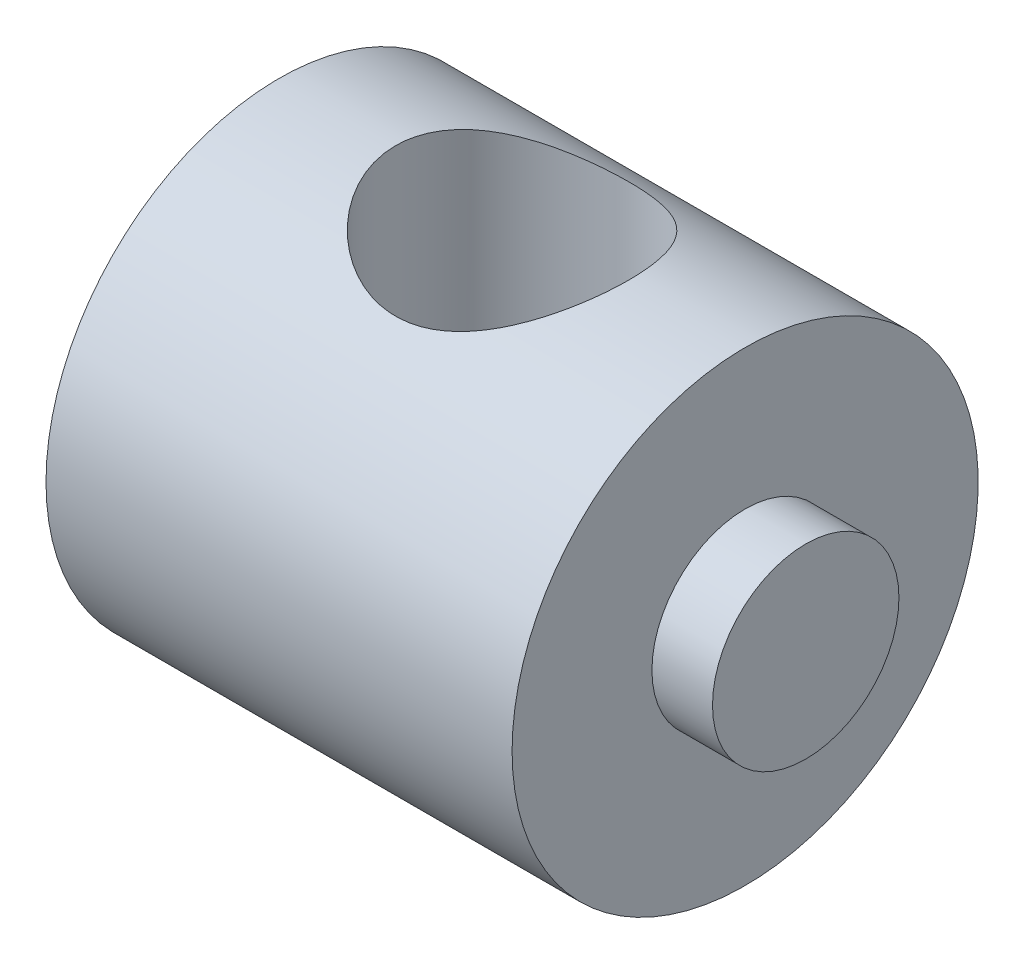
ISO-10303-21;
HEADER;
FILE_DESCRIPTION(('STEP AP214'),'2;1');
FILE_NAME('part.step','',(''),(''),'','','');
FILE_SCHEMA(('AUTOMOTIVE_DESIGN { 1 0 10303 214 1 1 1 1 }'));
ENDSEC;
DATA;
#1=APPLICATION_CONTEXT('core data for automotive mechanical design processes');
#2=APPLICATION_PROTOCOL_DEFINITION('international standard','automotive_design',2000,#1);
#3=PRODUCT_CONTEXT('',#1,'mechanical');
#4=PRODUCT('Part','Part','',(#3));
#5=PRODUCT_RELATED_PRODUCT_CATEGORY('part','',(#4));
#6=PRODUCT_DEFINITION_FORMATION('','',#4);
#7=PRODUCT_DEFINITION_CONTEXT('part definition',#1,'design');
#8=PRODUCT_DEFINITION('design','',#6,#7);
#9=PRODUCT_DEFINITION_SHAPE('','',#8);
#10=(LENGTH_UNIT() NAMED_UNIT(*) SI_UNIT(.MILLI.,.METRE.));
#11=(NAMED_UNIT(*) PLANE_ANGLE_UNIT() SI_UNIT($,.RADIAN.));
#12=(NAMED_UNIT(*) SI_UNIT($,.STERADIAN.) SOLID_ANGLE_UNIT());
#13=UNCERTAINTY_MEASURE_WITH_UNIT(LENGTH_MEASURE(1.E-05),#10,'distance_accuracy_value','');
#14=(GEOMETRIC_REPRESENTATION_CONTEXT(3) GLOBAL_UNCERTAINTY_ASSIGNED_CONTEXT((#13)) GLOBAL_UNIT_ASSIGNED_CONTEXT((#10,
#11,#12)) REPRESENTATION_CONTEXT('',''));
#15=CARTESIAN_POINT('',(0.,0.,0.));
#16=DIRECTION('',(0.,0.,1.));
#17=DIRECTION('',(1.,0.,0.));
#18=AXIS2_PLACEMENT_3D('',#15,#16,#17);
#19=CARTESIAN_POINT('',(0.,0.,0.));
#20=DIRECTION('',(-1.,0.,0.));
#21=DIRECTION('',(0.,0.,1.));
#22=AXIS2_PLACEMENT_3D('',#19,#20,#21);
#23=CYLINDRICAL_SURFACE('',#22,10.);
#24=CARTESIAN_POINT('',(2.6,0.,0.));
#25=DIRECTION('',(-1.,0.,0.));
#26=DIRECTION('',(0.,0.,1.));
#27=AXIS2_PLACEMENT_3D('',#24,#25,#26);
#28=CIRCLE('',#27,10.);
#29=CARTESIAN_POINT('',(2.6,0.,10.));
#30=VERTEX_POINT('',#29);
#31=EDGE_CURVE('E105',#30,#30,#28,.T.);
#32=ORIENTED_EDGE('',*,*,#31,.F.);
#33=EDGE_LOOP('',(#32));
#34=FACE_BOUND('',#33,.T.);
#35=CARTESIAN_POINT('',(22.6,0.,0.));
#36=DIRECTION('',(-1.,0.,0.));
#37=DIRECTION('',(0.,0.,1.));
#38=AXIS2_PLACEMENT_3D('',#35,#36,#37);
#39=CIRCLE('',#38,10.);
#40=CARTESIAN_POINT('',(22.6,0.,10.));
#41=VERTEX_POINT('',#40);
#42=EDGE_CURVE('E107',#41,#41,#39,.T.);
#43=ORIENTED_EDGE('',*,*,#42,.T.);
#44=EDGE_LOOP('',(#43));
#45=FACE_BOUND('',#44,.T.);
#46=CARTESIAN_POINT('',(7.6,10.,0.));
#47=CARTESIAN_POINT('',(7.60000043221603,9.99999960171885,0.131488890078729));
#48=CARTESIAN_POINT('',(7.60519277528512,9.99740053121283,0.262986970217151));
#49=CARTESIAN_POINT('',(7.62590289411204,9.98706977835168,0.525014586348055));
#50=CARTESIAN_POINT('',(7.64142516176398,9.97933586314931,0.655543676003294));
#51=CARTESIAN_POINT('',(7.68264077947734,9.95892066969002,0.914783203431132));
#52=CARTESIAN_POINT('',(7.70834863440625,9.94623233642881,1.04349077535257));
#53=CARTESIAN_POINT('',(7.76965067256346,9.91622716576671,1.29802636754293));
#54=CARTESIAN_POINT('',(7.80524889740563,9.89890843630383,1.42385318781692));
#55=CARTESIAN_POINT('',(7.8857784824513,9.86015430154804,1.67121386584967));
#56=CARTESIAN_POINT('',(7.93066864854805,9.83873709670758,1.79276399094561));
#57=CARTESIAN_POINT('',(8.02944879780695,9.79224427489324,2.03144447751189));
#58=CARTESIAN_POINT('',(8.08334216819345,9.7671672814684,2.14857315511665));
#59=CARTESIAN_POINT('',(8.25779962893898,9.68730860488736,2.49222561412914));
#60=CARTESIAN_POINT('',(8.39123077324006,9.6278546021617,2.71128846115303));
#61=CARTESIAN_POINT('',(8.69760528124455,9.49780663424161,3.13758045755123));
#62=CARTESIAN_POINT('',(8.87245069027972,9.42675632671347,3.34329192972867));
#63=CARTESIAN_POINT('',(9.25258908828315,9.28300214475253,3.72388133818107));
#64=CARTESIAN_POINT('',(9.45790506198385,9.21029705743543,3.89873577832562));
#65=CARTESIAN_POINT('',(9.91247514746428,9.06493867332993,4.22628385620054));
#66=CARTESIAN_POINT('',(10.1639018913175,8.99272664170302,4.37620734766693));
#67=CARTESIAN_POINT('',(10.5599180443676,8.89637417546677,4.56723365243867));
#68=CARTESIAN_POINT('',(10.6951182905603,8.86624279684719,4.62527981130997));
#69=CARTESIAN_POINT('',(10.9710012517741,8.81109611627222,4.72948843578256));
#70=CARTESIAN_POINT('',(11.1116806636392,8.78607778701962,4.77565793744269));
#71=CARTESIAN_POINT('',(11.388992754156,8.74350562362059,4.85313805846159));
#72=CARTESIAN_POINT('',(11.5253704799779,8.72559704108876,4.88516762296958));
#73=CARTESIAN_POINT('',(11.8009256974796,8.69596333711106,4.93772573892405));
#74=CARTESIAN_POINT('',(11.9401016630061,8.68423493515241,4.95826039236648));
#75=CARTESIAN_POINT('',(12.2200074611112,8.66746161087014,4.98752398958935));
#76=CARTESIAN_POINT('',(12.3607363063141,8.66241266349288,4.99626004329765));
#77=CARTESIAN_POINT('',(12.6425011762896,8.65921299638945,5.00180399494054));
#78=CARTESIAN_POINT('',(12.7835371704714,8.66106161851229,4.99861303092503));
#79=CARTESIAN_POINT('',(13.0477035728769,8.67093727173593,4.98145803092845));
#80=CARTESIAN_POINT('',(13.1709526028102,8.6781966350113,4.96883208371091));
#81=CARTESIAN_POINT('',(13.4158212139671,8.69773906996623,4.93454402662215));
#82=CARTESIAN_POINT('',(13.5374402710219,8.71002371946268,4.91287907868333));
#83=CARTESIAN_POINT('',(13.7781978743128,8.73921479576949,4.86076278292653));
#84=CARTESIAN_POINT('',(13.89733672485,8.75612065195561,4.83031251988904));
#85=CARTESIAN_POINT('',(14.1324713769544,8.79403073984606,4.76094319159973));
#86=CARTESIAN_POINT('',(14.2484659232761,8.81503658165342,4.72202079856857));
#87=CARTESIAN_POINT('',(14.5960068716186,8.88436032421636,4.59108661358501));
#88=CARTESIAN_POINT('',(14.8216933560379,8.93828791833521,4.48608785825886));
#89=CARTESIAN_POINT('',(15.2532101182228,9.05517433078602,4.24519591002764));
#90=CARTESIAN_POINT('',(15.4590314177592,9.11813720101032,4.10928884013355));
#91=CARTESIAN_POINT('',(15.8725885282038,9.25565455759079,3.79034422310328));
#92=CARTESIAN_POINT('',(16.0772580077073,9.3306665420313,3.60351571642877));
#93=CARTESIAN_POINT('',(16.4537034656887,9.47739013910051,3.19773444843253));
#94=CARTESIAN_POINT('',(16.6254637238212,9.54910016205801,2.97876642220598));
#95=CARTESIAN_POINT('',(16.8584408971132,9.65034506582221,2.62430600098781));
#96=CARTESIAN_POINT('',(16.9333520951455,9.68370380274255,2.49871002336159));
#97=CARTESIAN_POINT('',(17.0722082029724,9.74663052718473,2.2407106014256));
#98=CARTESIAN_POINT('',(17.1361577355911,9.77620011135783,2.1083100575541));
#99=CARTESIAN_POINT('',(17.2523988753834,9.83067553510545,1.83762803314804));
#100=CARTESIAN_POINT('',(17.3046951755248,9.85558325144946,1.69934894682179));
#101=CARTESIAN_POINT('',(17.39702492908,9.89999026457503,1.41791187896083));
#102=CARTESIAN_POINT('',(17.4370597931822,9.91949018350378,1.27475446078987));
#103=CARTESIAN_POINT('',(17.501533563503,9.95109597328192,0.996798015430413));
#104=CARTESIAN_POINT('',(17.5269895154024,9.96368046334326,0.862288674029798));
#105=CARTESIAN_POINT('',(17.5668080412236,9.98343035732267,0.591248360012467));
#106=CARTESIAN_POINT('',(17.5811715957901,9.99059624028198,0.454717567193952));
#107=CARTESIAN_POINT('',(17.5986131620341,9.99930380487356,0.180810709359647));
#108=CARTESIAN_POINT('',(17.6016954942669,10.000847639673,0.0434349881359));
#109=CARTESIAN_POINT('',(17.5965444260812,9.99827237859039,-0.23104760858155));
#110=CARTESIAN_POINT('',(17.5883115264507,9.99415353332644,-0.368154495704339));
#111=CARTESIAN_POINT('',(17.561721326159,9.98090973082445,-0.630324023952244));
#112=CARTESIAN_POINT('',(17.5442016224066,9.97219922243105,-0.755493751243217));
#113=CARTESIAN_POINT('',(17.4998255264294,9.95027227352716,-1.00380426086804));
#114=CARTESIAN_POINT('',(17.4729661769068,9.93705440583578,-1.12694438760008));
#115=CARTESIAN_POINT('',(17.4101973166375,9.90642450404114,-1.37032307172125));
#116=CARTESIAN_POINT('',(17.3742905753219,9.88901375346268,-1.49056250470176));
#117=CARTESIAN_POINT('',(17.2937718386768,9.85039368148873,-1.72747946867538));
#118=CARTESIAN_POINT('',(17.2491565086473,9.82918290524069,-1.84415561535681));
#119=CARTESIAN_POINT('',(17.1000521931497,9.75922876416581,-2.19430354472275));
#120=CARTESIAN_POINT('',(16.9820592582149,9.70504904478179,-2.42111320848944));
#121=CARTESIAN_POINT('',(16.7144478067803,9.58719375745591,-2.8523456015808));
#122=CARTESIAN_POINT('',(16.5648158180077,9.5235141477638,-3.05675873773466));
#123=CARTESIAN_POINT('',(16.2212127089634,9.38541505392103,-3.45882132675025));
#124=CARTESIAN_POINT('',(16.0243304082476,9.31055499361994,-3.65383533419946));
#125=CARTESIAN_POINT('',(15.600329462866,9.16310881759143,-4.00930667677967));
#126=CARTESIAN_POINT('',(15.3731900760017,9.09052430437331,-4.16974010650665));
#127=CARTESIAN_POINT('',(15.0075094337707,8.98785260582618,-4.38466016919211));
#128=CARTESIAN_POINT('',(14.8781491254565,8.95395955241383,-4.4532676226712));
#129=CARTESIAN_POINT('',(14.613105899221,8.89022352415078,-4.57918112262683));
#130=CARTESIAN_POINT('',(14.4774258796241,8.86037871680369,-4.63649228788887));
#131=CARTESIAN_POINT('',(14.2007229646748,8.80590327365628,-4.73913999074898));
#132=CARTESIAN_POINT('',(14.05970454425,8.78126837994729,-4.78448631442401));
#133=CARTESIAN_POINT('',(13.7733089571752,8.73822819098157,-4.86265004333096));
#134=CARTESIAN_POINT('',(13.6279324691725,8.7198219312185,-4.89546938847111));
#135=CARTESIAN_POINT('',(13.3482350184647,8.69151275671387,-4.94553834792942));
#136=CARTESIAN_POINT('',(13.2141921168801,8.6809632703526,-4.96397997433445));
#137=CARTESIAN_POINT('',(12.9447147543026,8.66606824539577,-4.98993873206132));
#138=CARTESIAN_POINT('',(12.8092804406048,8.66172205679783,-4.99745700797003));
#139=CARTESIAN_POINT('',(12.5382430749954,8.65941425656731,-5.00145477351748));
#140=CARTESIAN_POINT('',(12.4026400991504,8.66145040076354,-4.99793814327598));
#141=CARTESIAN_POINT('',(12.1324144420521,8.67181681785816,-4.97992974203946));
#142=CARTESIAN_POINT('',(11.9977917208955,8.68014683308828,-4.96543842034336));
#143=CARTESIAN_POINT('',(11.743439797841,8.70167828744801,-4.92759757627215));
#144=CARTESIAN_POINT('',(11.6235174403761,8.71433770908853,-4.90522766015));
#145=CARTESIAN_POINT('',(11.3861388094325,8.74411599480516,-4.85194376743193));
#146=CARTESIAN_POINT('',(11.268683310666,8.76123623781642,-4.82102714868722));
#147=CARTESIAN_POINT('',(10.9210828848871,8.81854231868724,-4.71590306073959));
#148=CARTESIAN_POINT('',(10.695543905014,8.86468813771129,-4.62929708984156));
#149=CARTESIAN_POINT('',(10.2468396576875,8.97142890954605,-4.41907164675021));
#150=CARTESIAN_POINT('',(10.0248519240107,9.03278633647388,-4.29335633682031));
#151=CARTESIAN_POINT('',(9.60363589040429,9.16176636495219,-4.01075421010745));
#152=CARTESIAN_POINT('',(9.40441951655584,9.22939221620456,-3.85385117607732));
#153=CARTESIAN_POINT('',(9.00929214152929,9.37311444600789,-3.49102748964406));
#154=CARTESIAN_POINT('',(8.81672398123239,9.44924162905911,-3.28146736342599));
#155=CARTESIAN_POINT('',(8.46866557881673,9.59389514971535,-2.83072875767415));
#156=CARTESIAN_POINT('',(8.31319532225643,9.66241737976037,-2.58953334336126));
#157=CARTESIAN_POINT('',(8.11136958547318,9.7541901337583,-2.20753881885374));
#158=CARTESIAN_POINT('',(8.04913292059363,9.78304209980293,-2.07625512570271));
#159=CARTESIAN_POINT('',(7.93606384387963,9.83614745234555,-1.80799529933999));
#160=CARTESIAN_POINT('',(7.88522582946939,9.86040309707969,-1.67102200205151));
#161=CARTESIAN_POINT('',(7.79565456163282,9.90354484128718,-1.39269501068688));
#162=CARTESIAN_POINT('',(7.75689490701229,9.92244264379385,-1.25135162347081));
#163=CARTESIAN_POINT('',(7.69186240373143,9.95434618112011,-0.965237205795559));
#164=CARTESIAN_POINT('',(7.66558192747297,9.96735551489675,-0.820468326048374));
#165=CARTESIAN_POINT('',(7.63052546800114,9.98476387878718,-0.56304165440816));
#166=CARTESIAN_POINT('',(7.61908824630799,9.99046741601665,-0.450825809730025));
#167=CARTESIAN_POINT('',(7.60382522174986,9.99808569986015,-0.225742246050266));
#168=CARTESIAN_POINT('',(7.59999962897115,10.000000341898,-0.112874509142188));
#169=CARTESIAN_POINT('',(7.6,10.,0.));
#170=B_SPLINE_CURVE_WITH_KNOTS('',3,(#46,#47,#48,#49,#50,#51,#52,#53,#54,#55,#56,#57,#58,#59,
#60,#61,#62,#63,#64,#65,#66,#67,#68,#69,#70,#71,#72,#73,#74,#75,#76,#77,#78,#79,#80,#81,#82,#83,
#84,#85,#86,#87,#88,#89,#90,#91,#92,#93,#94,#95,#96,#97,#98,#99,#100,#101,#102,#103,#104,#105,
#106,#107,#108,#109,#110,#111,#112,#113,#114,#115,#116,#117,#118,#119,#120,#121,#122,#123,#124,
#125,#126,#127,#128,#129,#130,#131,#132,#133,#134,#135,#136,#137,#138,#139,#140,#141,#142,#143,
#144,#145,#146,#147,#148,#149,#150,#151,#152,#153,#154,#155,#156,#157,#158,#159,#160,#161,#162,
#163,#164,#165,#166,#167,#168,#169),.UNSPECIFIED.,.T.,.F.,(4,2,2,2,2,2,2,2,2,2,2,2,2,2,2,2,2,2,
2,2,2,2,2,2,2,2,2,2,2,2,2,2,2,2,2,2,2,2,2,2,2,2,2,2,2,2,2,2,2,2,2,2,2,2,2,2,2,2,2,2,2,4),(0.,
0.394355294649889,0.788882184037816,1.18397293369034,1.57922537181693,1.97276168530542,
2.36644639154631,3.15295441699266,3.98704440767526,4.821766802355,5.72122193562245,
6.17125359989458,6.62101803579305,7.04410338623951,7.46696393118357,7.88956954321096,
8.3121348321667,8.68401534897462,9.05601271689169,9.42796417149684,9.80006198990959,
10.56083380205,11.3219478566368,12.1795688603196,13.03759852356,13.4870830845772,
13.9363776171858,14.3854908824167,14.8345524573652,15.2464230691106,15.6582572644723,
16.0699337163998,16.4815919489941,16.8612200640511,17.240968493866,17.6206008225791,
18.0003788066131,18.7808755264614,19.5617052624835,20.4192132572739,21.2773121558255,
21.7277011924365,22.1778856687596,22.6277007885002,23.0774462222894,23.4840267197959,
23.8905646113036,24.2969595710184,24.703337894006,25.0708552370355,25.4384863225851,
26.1732662495599,26.9574126491567,27.7419678673239,28.6218519479817,29.5022089791541,
29.9460734671028,30.3897193096443,30.8323885049027,31.2747867798493,31.6133053554877,
31.9518332743451),.UNSPECIFIED.);
#171=CARTESIAN_POINT('',(7.6,10.,0.));
#172=VERTEX_POINT('',#171);
#173=EDGE_CURVE('E10',#172,#172,#170,.T.);
#174=ORIENTED_EDGE('',*,*,#173,.F.);
#175=EDGE_LOOP('',(#174));
#176=FACE_BOUND('',#175,.T.);
#177=CARTESIAN_POINT('',(12.6,-8.66025403784439,-5.));
#178=CARTESIAN_POINT('',(12.7303316567961,-8.66025482828518,-4.99999937774203));
#179=CARTESIAN_POINT('',(12.8606749083469,-8.66320639320551,-4.99489703999514));
#180=CARTESIAN_POINT('',(13.1203552182528,-8.67490215579888,-4.97455590140418));
#181=CARTESIAN_POINT('',(13.2496917797997,-8.68364905023327,-4.95931238151411));
#182=CARTESIAN_POINT('',(13.5065135375637,-8.70662912382781,-4.91885673177676));
#183=CARTESIAN_POINT('',(13.633995503785,-8.72087090589727,-4.89362896878987));
#184=CARTESIAN_POINT('',(13.8860174644883,-8.75432466229382,-4.83352579766962));
#185=CARTESIAN_POINT('',(14.010556154035,-8.77353879767271,-4.79864619425836));
#186=CARTESIAN_POINT('',(14.3771112075341,-8.83745677232208,-4.68053466147079));
#187=CARTESIAN_POINT('',(14.6137323207336,-8.88859880977519,-4.58356144574885));
#188=CARTESIAN_POINT('',(15.0671619547889,-9.00213659941723,-4.35632594214355));
#189=CARTESIAN_POINT('',(15.2839694029475,-9.06453296036385,-4.22606185336434));
#190=CARTESIAN_POINT('',(15.7115106177474,-9.19984032823,-3.92334549410416));
#191=CARTESIAN_POINT('',(15.9202685823228,-9.27319410334728,-3.74829976483492));
#192=CARTESIAN_POINT('',(16.3070690515488,-9.41860822234891,-3.36622943427774));
#193=CARTESIAN_POINT('',(16.4850962349664,-9.49066790509843,-3.15918897852743));
#194=CARTESIAN_POINT('',(16.7312264286858,-9.59484443095073,-2.82033206345807));
#195=CARTESIAN_POINT('',(16.8119131521005,-9.62993554487431,-2.69838192133586));
#196=CARTESIAN_POINT('',(16.9626286654218,-9.69680156689125,-2.44722131237053));
#197=CARTESIAN_POINT('',(17.0326616973628,-9.72857779329811,-2.31801376345375));
#198=CARTESIAN_POINT('',(17.1613762312931,-9.78789520431625,-2.05317391777883));
#199=CARTESIAN_POINT('',(17.2200606574798,-9.81543747951442,-1.91754328730047));
#200=CARTESIAN_POINT('',(17.3254310158281,-9.86547242365067,-1.64079696990286));
#201=CARTESIAN_POINT('',(17.3721182224333,-9.88796562891049,-1.49968186742445));
#202=CARTESIAN_POINT('',(17.4500155125182,-9.92580359946711,-1.22330436599559));
#203=CARTESIAN_POINT('',(17.4820901096035,-9.94154295735176,-1.08833937324155));
#204=CARTESIAN_POINT('',(17.5349664286038,-9.96761571585522,-0.815709188800211));
#205=CARTESIAN_POINT('',(17.5557692480603,-9.97794964280152,-0.678044261360657));
#206=CARTESIAN_POINT('',(17.5858199114167,-9.99290900237256,-0.401217055741358));
#207=CARTESIAN_POINT('',(17.5950733329762,-9.99753719051025,-0.262055533104011));
#208=CARTESIAN_POINT('',(17.6019143333982,-10.0009568128334,0.0166220416280697));
#209=CARTESIAN_POINT('',(17.5995026259935,-9.99974860411976,0.156138071510183));
#210=CARTESIAN_POINT('',(17.5837693970487,-9.99189263105534,0.422158287145515));
#211=CARTESIAN_POINT('',(17.5714182292176,-9.9857287219252,0.548735568605435));
#212=CARTESIAN_POINT('',(17.537167427645,-9.9687211507105,0.80031234857487));
#213=CARTESIAN_POINT('',(17.515264778974,-9.95787601100424,0.925311336065688));
#214=CARTESIAN_POINT('',(17.4621537757626,-9.93176736436012,1.17280363036129));
#215=CARTESIAN_POINT('',(17.4309485341379,-9.91650533549045,1.29529776073403));
#216=CARTESIAN_POINT('',(17.3595523484822,-9.88192155120269,1.53706747687734));
#217=CARTESIAN_POINT('',(17.3193579627522,-9.86259824100145,1.6563418102202));
#218=CARTESIAN_POINT('',(17.1846254604358,-9.79859222392452,2.01140340124728));
#219=CARTESIAN_POINT('',(17.0766310411066,-9.74822622058318,2.24122720645224));
#220=CARTESIAN_POINT('',(16.8286703075067,-9.63687815372567,2.67992393299637));
#221=CARTESIAN_POINT('',(16.688692546844,-9.57589229137331,2.88878931500038));
#222=CARTESIAN_POINT('',(16.3655365262267,-9.44222356886893,3.30085071454948));
#223=CARTESIAN_POINT('',(16.1795253968794,-9.36897995679247,3.50164452019891));
#224=CARTESIAN_POINT('',(15.7770108060787,-9.22270586177088,3.87054772569916));
#225=CARTESIAN_POINT('',(15.5604841030917,-9.14967558498933,4.03863197852248));
#226=CARTESIAN_POINT('',(15.2088064627185,-9.04390911775424,4.2679539578839));
#227=CARTESIAN_POINT('',(15.0829490688498,-9.00829977481543,4.34240098162072));
#228=CARTESIAN_POINT('',(14.8244861217296,-8.94051483957135,4.48030007564995));
#229=CARTESIAN_POINT('',(14.6918834411214,-8.90833780331999,4.54375677655288));
#230=CARTESIAN_POINT('',(14.4207965096454,-8.84860631442917,4.65901104656178));
#231=CARTESIAN_POINT('',(14.2823158810192,-8.82104906525582,4.71081567564999));
#232=CARTESIAN_POINT('',(14.0003786539485,-8.7716484423619,4.80217514780264));
#233=CARTESIAN_POINT('',(13.8569227369748,-8.74980428958556,4.84173166119403));
#234=CARTESIAN_POINT('',(13.5777430649249,-8.71426171459813,4.90539138118897));
#235=CARTESIAN_POINT('',(13.4423062664424,-8.70005532848251,4.93047005719824));
#236=CARTESIAN_POINT('',(13.1693280921951,-8.67788216659553,4.96939299432912));
#237=CARTESIAN_POINT('',(13.0317869766089,-8.66991462570621,4.98323863305272));
#238=CARTESIAN_POINT('',(12.7558845075408,-8.66056020235633,4.99947854378905));
#239=CARTESIAN_POINT('',(12.61752366777,-8.65916956150024,5.0018793559994));
#240=CARTESIAN_POINT('',(12.3411790950675,-8.66301922537735,4.99520900229024));
#241=CARTESIAN_POINT('',(12.2031953373112,-8.66825908252539,4.98613861072293));
#242=CARTESIAN_POINT('',(11.9439119206006,-8.68421505193302,4.95828928039379));
#243=CARTESIAN_POINT('',(11.8224432856653,-8.69426699139328,4.94068517767344));
#244=CARTESIAN_POINT('',(11.5815824240837,-8.71910498639122,4.89671673345791));
#245=CARTESIAN_POINT('',(11.4621908489265,-8.73389250003321,4.87034969372092));
#246=CARTESIAN_POINT('',(11.1082899585571,-8.7846960742619,4.77850297980868));
#247=CARTESIAN_POINT('',(10.8778857081681,-8.82716454630259,4.7002591459757));
#248=CARTESIAN_POINT('',(10.4229067643173,-8.92681241600885,4.50823244687956));
#249=CARTESIAN_POINT('',(10.1990963080479,-8.98458205429472,4.392971424463));
#250=CARTESIAN_POINT('',(9.77266225441961,-9.10780608277644,4.13143421351039));
#251=CARTESIAN_POINT('',(9.57004962092247,-9.1732644129012,3.9851420924436));
#252=CARTESIAN_POINT('',(9.16510859636239,-9.31439795768908,3.64419701683803));
#253=CARTESIAN_POINT('',(8.96603551612007,-9.39032093861059,3.44577250062108));
#254=CARTESIAN_POINT('',(8.60291753315273,-9.53671997076951,3.01697632238968));
#255=CARTESIAN_POINT('',(8.43888446260488,-9.60719417697592,2.78659391213232));
#256=CARTESIAN_POINT('',(8.22099052622877,-9.70419418614479,2.41774074756936));
#257=CARTESIAN_POINT('',(8.15233790017969,-9.73542921288423,2.28903769990884));
#258=CARTESIAN_POINT('',(8.02624348134595,-9.79367711332059,2.02535752273871));
#259=CARTESIAN_POINT('',(7.96879672312384,-9.82069185600805,1.89038320507347));
#260=CARTESIAN_POINT('',(7.86578209154345,-9.86968940022035,1.61516754079524));
#261=CARTESIAN_POINT('',(7.8202085521106,-9.89167460130352,1.47492874316051));
#262=CARTESIAN_POINT('',(7.74149092398246,-9.92995088678441,1.19024723850078));
#263=CARTESIAN_POINT('',(7.70834536138541,-9.94624264638291,1.04580503217188));
#264=CARTESIAN_POINT('',(7.65740496637587,-9.97139931839171,0.767401441682124));
#265=CARTESIAN_POINT('',(7.63848039735717,-9.98080865626407,0.633694933854978));
#266=CARTESIAN_POINT('',(7.61150654681826,-9.99424478074505,0.364924207537125));
#267=CARTESIAN_POINT('',(7.60345642504287,-9.9982719832244,0.229860094759433));
#268=CARTESIAN_POINT('',(7.59833682281879,-10.0008314531461,-0.0404881253987298));
#269=CARTESIAN_POINT('',(7.60126414663715,-9.99936531979799,-0.175772157294895));
#270=CARTESIAN_POINT('',(7.6180525477526,-9.99098333266103,-0.445485239489125));
#271=CARTESIAN_POINT('',(7.63191332405239,-9.98406762889855,-0.579914313221436));
#272=CARTESIAN_POINT('',(7.66911767941731,-9.96560870935097,-0.83800421192803));
#273=CARTESIAN_POINT('',(7.69177283422685,-9.95440210269674,-0.961788818118176));
#274=CARTESIAN_POINT('',(7.74621315553766,-9.92767317989821,-1.20687032491423));
#275=CARTESIAN_POINT('',(7.77800122935662,-9.91214948953036,-1.32816642014826));
#276=CARTESIAN_POINT('',(7.88660824427135,-9.85961295376399,-1.68709586409475));
#277=CARTESIAN_POINT('',(7.97670192508612,-9.81661817605329,-1.91998814282436));
#278=CARTESIAN_POINT('',(8.19364222171955,-9.71629432734438,-2.37715486497024));
#279=CARTESIAN_POINT('',(8.32189596544927,-9.65843082383811,-2.60063468941493));
#280=CARTESIAN_POINT('',(8.60979030518456,-9.53440669320975,-3.02386422902506));
#281=CARTESIAN_POINT('',(8.76944531703204,-9.46824226032902,-3.22360297720279));
#282=CARTESIAN_POINT('',(9.13397517110684,-9.32643278468726,-3.61456788757425));
#283=CARTESIAN_POINT('',(9.3417690335459,-9.25049954016331,-3.80296860888285));
#284=CARTESIAN_POINT('',(9.78729704771451,-9.1031442101187,-4.14333626823683));
#285=CARTESIAN_POINT('',(10.0250574065678,-9.03172615645363,-4.29527097306548));
#286=CARTESIAN_POINT('',(10.4042196667176,-8.93341291054547,-4.49442606762734));
#287=CARTESIAN_POINT('',(10.536626328209,-8.90168698468313,-4.55675683233958));
#288=CARTESIAN_POINT('',(10.8072554637669,-8.8428797220414,-4.66985426801939));
#289=CARTESIAN_POINT('',(10.9454748987939,-8.81579599491154,-4.72062689492349));
#290=CARTESIAN_POINT('',(11.2264078742926,-8.76742025858705,-4.80987708806143));
#291=CARTESIAN_POINT('',(11.3691087930855,-8.74611337114853,-4.8483862843261));
#292=CARTESIAN_POINT('',(11.6580921444706,-8.71014784774039,-4.91270711070743));
#293=CARTESIAN_POINT('',(11.8043719976095,-8.69548456411172,-4.93852761851021));
#294=CARTESIAN_POINT('',(12.0589978869293,-8.67647541111358,-4.97182308032502));
#295=CARTESIAN_POINT('',(12.1668242162268,-8.67040719452513,-4.98237929832923));
#296=CARTESIAN_POINT('',(12.3830976599821,-8.66229604436744,-4.99646825199979));
#297=CARTESIAN_POINT('',(12.4915448154826,-8.66025338008092,-5.00000051781052));
#298=CARTESIAN_POINT('',(12.6,-8.66025403784439,-5.));
#299=B_SPLINE_CURVE_WITH_KNOTS('',3,(#177,#178,#179,#180,#181,#182,#183,#184,#185,#186,#187,
#188,#189,#190,#191,#192,#193,#194,#195,#196,#197,#198,#199,#200,#201,#202,#203,#204,#205,#206,
#207,#208,#209,#210,#211,#212,#213,#214,#215,#216,#217,#218,#219,#220,#221,#222,#223,#224,#225,
#226,#227,#228,#229,#230,#231,#232,#233,#234,#235,#236,#237,#238,#239,#240,#241,#242,#243,#244,
#245,#246,#247,#248,#249,#250,#251,#252,#253,#254,#255,#256,#257,#258,#259,#260,#261,#262,#263,
#264,#265,#266,#267,#268,#269,#270,#271,#272,#273,#274,#275,#276,#277,#278,#279,#280,#281,#282,
#283,#284,#285,#286,#287,#288,#289,#290,#291,#292,#293,#294,#295,#296,#297,#298),.UNSPECIFIED.,
.T.,.F.,(4,2,2,2,2,2,2,2,2,2,2,2,2,2,2,2,2,2,2,2,2,2,2,2,2,2,2,2,2,2,2,2,2,2,2,2,2,2,2,2,2,2,2,
2,2,2,2,2,2,2,2,2,2,2,2,2,2,2,2,2,4),(0.,0.390882384556487,0.781946787673773,1.17362595011564,
1.56547562833135,2.34415414386117,3.12287479153474,3.96582272680016,4.80918971852754,
5.25982992442625,5.71029022430251,6.16063429887936,6.61093051439735,7.02920538093652,
7.44743951241415,7.86547158389039,8.28347807833437,8.66500933177613,9.0466611030143,
9.42818530565609,9.80985583438832,10.5829669450729,11.3563551760292,12.2028497813491,
13.0499926207968,13.501002097322,13.9518210829089,14.4023661773263,14.8528498019288,
15.2676702585959,15.6824398346428,16.0969723603126,16.5114769048702,16.8804871114428,
17.2496110473148,17.9873544979167,18.7592666964179,19.5315761871159,20.4012390551442,
21.2711951250237,21.7182117808489,22.1650299066984,22.6116344121698,23.0581859356052,
23.4637505264203,23.8692837779652,24.2746989806128,24.6801030225936,25.0586722294313,
25.4373620814588,26.1940875134848,26.9831783738577,27.7726323429201,28.6406529303875,
29.5094379801419,29.9581473751205,30.4066250230036,30.8539364017616,31.3009343703532,
31.6261844795329,31.9514563450475),.UNSPECIFIED.);
#300=CARTESIAN_POINT('',(12.6,-8.66025403784439,-5.));
#301=VERTEX_POINT('',#300);
#302=EDGE_CURVE('E55',#301,#301,#299,.T.);
#303=ORIENTED_EDGE('',*,*,#302,.F.);
#304=EDGE_LOOP('',(#303));
#305=FACE_BOUND('',#304,.T.);
#306=ADVANCED_FACE('F43',(#34,#45,#176,#305),#23,.T.);
#307=CARTESIAN_POINT('',(0.,0.,0.));
#308=DIRECTION('',(1.,0.,0.));
#309=DIRECTION('',(0.,0.,-1.));
#310=AXIS2_PLACEMENT_3D('',#307,#308,#309);
#311=PLANE('',#310);
#312=CARTESIAN_POINT('',(0.,0.,0.));
#313=DIRECTION('',(-1.,0.,0.));
#314=DIRECTION('',(0.,0.,1.));
#315=AXIS2_PLACEMENT_3D('',#312,#313,#314);
#316=CIRCLE('',#315,4.);
#317=CARTESIAN_POINT('',(0.,0.,4.));
#318=VERTEX_POINT('',#317);
#319=EDGE_CURVE('E59',#318,#318,#316,.T.);
#320=ORIENTED_EDGE('',*,*,#319,.T.);
#321=EDGE_LOOP('',(#320));
#322=FACE_BOUND('',#321,.T.);
#323=ADVANCED_FACE('F45',(#322),#311,.F.);
#324=CARTESIAN_POINT('',(0.,0.,0.));
#325=DIRECTION('',(-1.,0.,0.));
#326=DIRECTION('',(0.,0.,1.));
#327=AXIS2_PLACEMENT_3D('',#324,#325,#326);
#328=CYLINDRICAL_SURFACE('',#327,4.);
#329=ORIENTED_EDGE('',*,*,#319,.F.);
#330=EDGE_LOOP('',(#329));
#331=FACE_BOUND('',#330,.T.);
#332=CARTESIAN_POINT('',(2.6,0.,0.));
#333=DIRECTION('',(-1.,0.,0.));
#334=DIRECTION('',(0.,0.,1.));
#335=AXIS2_PLACEMENT_3D('',#332,#333,#334);
#336=CIRCLE('',#335,4.);
#337=CARTESIAN_POINT('',(2.6,0.,4.));
#338=VERTEX_POINT('',#337);
#339=EDGE_CURVE('E63',#338,#338,#336,.T.);
#340=ORIENTED_EDGE('',*,*,#339,.T.);
#341=EDGE_LOOP('',(#340));
#342=FACE_BOUND('',#341,.T.);
#343=ADVANCED_FACE('F93',(#331,#342),#328,.T.);
#344=CARTESIAN_POINT('',(2.6,4.,0.));
#345=DIRECTION('',(1.,0.,0.));
#346=DIRECTION('',(0.,0.,-1.));
#347=AXIS2_PLACEMENT_3D('',#344,#345,#346);
#348=PLANE('',#347);
#349=ORIENTED_EDGE('',*,*,#339,.F.);
#350=EDGE_LOOP('',(#349));
#351=FACE_BOUND('',#350,.T.);
#352=ORIENTED_EDGE('',*,*,#31,.T.);
#353=EDGE_LOOP('',(#352));
#354=FACE_BOUND('',#353,.T.);
#355=ADVANCED_FACE('F87',(#351,#354),#348,.F.);
#356=CARTESIAN_POINT('',(22.6,10.,0.));
#357=DIRECTION('',(-1.,0.,0.));
#358=DIRECTION('',(0.,0.,1.));
#359=AXIS2_PLACEMENT_3D('',#356,#357,#358);
#360=PLANE('',#359);
#361=ORIENTED_EDGE('',*,*,#42,.F.);
#362=EDGE_LOOP('',(#361));
#363=FACE_BOUND('',#362,.T.);
#364=CARTESIAN_POINT('',(22.6,0.,0.));
#365=DIRECTION('',(-1.,0.,0.));
#366=DIRECTION('',(0.,0.,1.));
#367=AXIS2_PLACEMENT_3D('',#364,#365,#366);
#368=CIRCLE('',#367,4.);
#369=CARTESIAN_POINT('',(22.6,0.,4.));
#370=VERTEX_POINT('',#369);
#371=EDGE_CURVE('E112',#370,#370,#368,.T.);
#372=ORIENTED_EDGE('',*,*,#371,.T.);
#373=EDGE_LOOP('',(#372));
#374=FACE_BOUND('',#373,.T.);
#375=ADVANCED_FACE('F83',(#363,#374),#360,.F.);
#376=CARTESIAN_POINT('',(0.,0.,0.));
#377=DIRECTION('',(-1.,0.,0.));
#378=DIRECTION('',(0.,0.,1.));
#379=AXIS2_PLACEMENT_3D('',#376,#377,#378);
#380=CYLINDRICAL_SURFACE('',#379,4.);
#381=ORIENTED_EDGE('',*,*,#371,.F.);
#382=EDGE_LOOP('',(#381));
#383=FACE_BOUND('',#382,.T.);
#384=CARTESIAN_POINT('',(25.2,0.,0.));
#385=DIRECTION('',(-1.,0.,0.));
#386=DIRECTION('',(0.,0.,1.));
#387=AXIS2_PLACEMENT_3D('',#384,#385,#386);
#388=CIRCLE('',#387,4.);
#389=CARTESIAN_POINT('',(25.2,0.,4.));
#390=VERTEX_POINT('',#389);
#391=EDGE_CURVE('E115',#390,#390,#388,.T.);
#392=ORIENTED_EDGE('',*,*,#391,.T.);
#393=EDGE_LOOP('',(#392));
#394=FACE_BOUND('',#393,.T.);
#395=ADVANCED_FACE('F79',(#383,#394),#380,.T.);
#396=CARTESIAN_POINT('',(25.2,4.,0.));
#397=DIRECTION('',(-1.,0.,0.));
#398=DIRECTION('',(0.,0.,1.));
#399=AXIS2_PLACEMENT_3D('',#396,#397,#398);
#400=PLANE('',#399);
#401=ORIENTED_EDGE('',*,*,#391,.F.);
#402=EDGE_LOOP('',(#401));
#403=FACE_BOUND('',#402,.T.);
#404=ADVANCED_FACE('F75',(#403),#400,.F.);
#405=CARTESIAN_POINT('',(12.6,14.,0.));
#406=DIRECTION('',(0.,-1.,0.));
#407=DIRECTION('',(0.,0.,-1.));
#408=AXIS2_PLACEMENT_3D('',#405,#406,#407);
#409=CYLINDRICAL_SURFACE('',#408,5.);
#410=ORIENTED_EDGE('',*,*,#302,.T.);
#411=EDGE_LOOP('',(#410));
#412=FACE_BOUND('',#411,.T.);
#413=ORIENTED_EDGE('',*,*,#173,.T.);
#414=EDGE_LOOP('',(#413));
#415=FACE_BOUND('',#414,.T.);
#416=ADVANCED_FACE('F69',(#412,#415),#409,.F.);
#417=CLOSED_SHELL('',(#306,#323,#343,#355,#375,#395,#404,#416));
#418=MANIFOLD_SOLID_BREP('B2',#417);
#419=ADVANCED_BREP_SHAPE_REPRESENTATION('',(#18,#418),#14);
#420=SHAPE_DEFINITION_REPRESENTATION(#9,#419);
ENDSEC;
END-ISO-10303-21;
